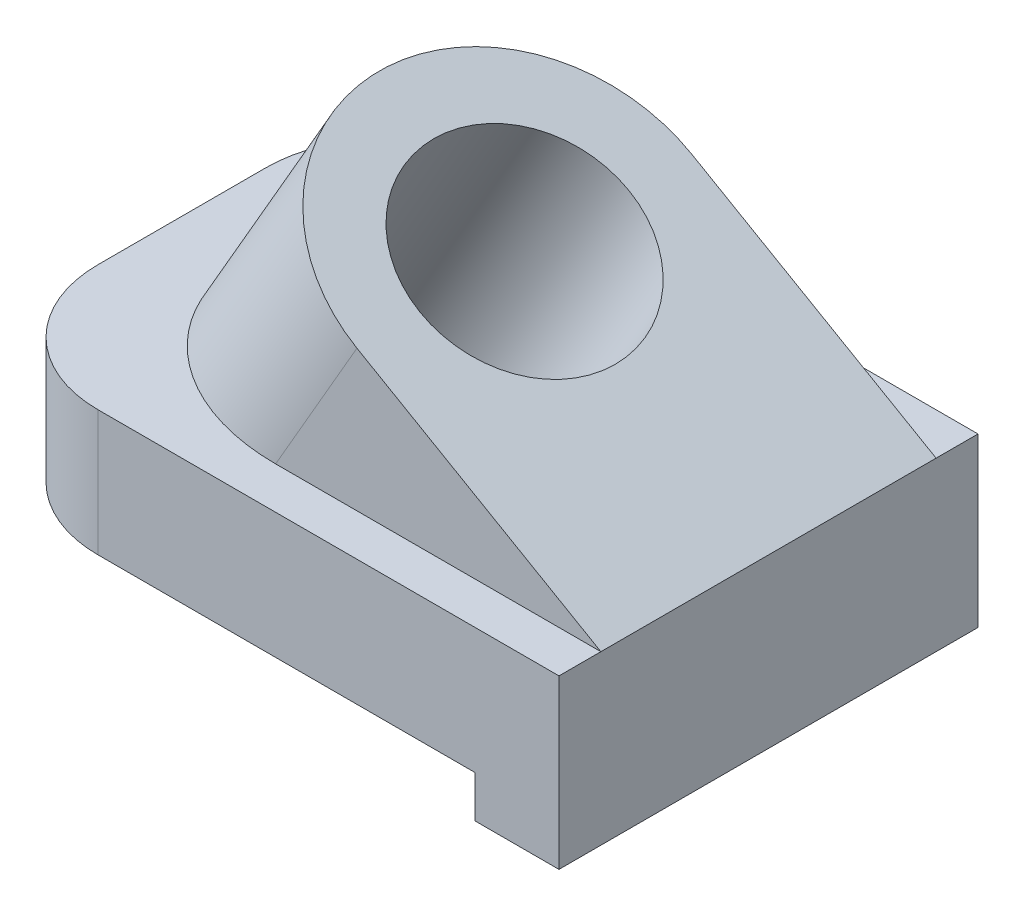
ISO-10303-21;
HEADER;
FILE_DESCRIPTION(('STEP AP214'),'2;1');
FILE_NAME('part.step','',(''),(''),'','','');
FILE_SCHEMA(('AUTOMOTIVE_DESIGN { 1 0 10303 214 1 1 1 1 }'));
ENDSEC;
DATA;
#1=APPLICATION_CONTEXT('core data for automotive mechanical design processes');
#2=APPLICATION_PROTOCOL_DEFINITION('international standard','automotive_design',2000,#1);
#3=PRODUCT_CONTEXT('',#1,'mechanical');
#4=PRODUCT('Part','Part','',(#3));
#5=PRODUCT_RELATED_PRODUCT_CATEGORY('part','',(#4));
#6=PRODUCT_DEFINITION_FORMATION('','',#4);
#7=PRODUCT_DEFINITION_CONTEXT('part definition',#1,'design');
#8=PRODUCT_DEFINITION('design','',#6,#7);
#9=PRODUCT_DEFINITION_SHAPE('','',#8);
#10=(LENGTH_UNIT() NAMED_UNIT(*) SI_UNIT(.MILLI.,.METRE.));
#11=(NAMED_UNIT(*) PLANE_ANGLE_UNIT() SI_UNIT($,.RADIAN.));
#12=(NAMED_UNIT(*) SI_UNIT($,.STERADIAN.) SOLID_ANGLE_UNIT());
#13=UNCERTAINTY_MEASURE_WITH_UNIT(LENGTH_MEASURE(1.E-05),#10,'distance_accuracy_value','');
#14=(GEOMETRIC_REPRESENTATION_CONTEXT(3) GLOBAL_UNCERTAINTY_ASSIGNED_CONTEXT((#13)) GLOBAL_UNIT_ASSIGNED_CONTEXT((#10,
#11,#12)) REPRESENTATION_CONTEXT('',''));
#15=CARTESIAN_POINT('',(0.,0.,0.));
#16=DIRECTION('',(0.,0.,1.));
#17=DIRECTION('',(1.,0.,0.));
#18=AXIS2_PLACEMENT_3D('',#15,#16,#17);
#19=CARTESIAN_POINT('',(70.,20.,25.));
#20=DIRECTION('',(0.,-1.,0.));
#21=DIRECTION('',(1.,0.,0.));
#22=AXIS2_PLACEMENT_3D('',#19,#20,#21);
#23=PLANE('',#22);
#24=DIRECTION('',(1.,0.,0.));
#25=VECTOR('',#24,1.);
#26=CARTESIAN_POINT('',(-2.87710911225075,20.,20.));
#27=LINE('',#26,#25);
#28=CARTESIAN_POINT('',(31.1896782116154,20.,20.));
#29=VERTEX_POINT('',#28);
#30=CARTESIAN_POINT('',(70.,20.,20.));
#31=VERTEX_POINT('',#30);
#32=EDGE_CURVE('E48',#29,#31,#27,.T.);
#33=ORIENTED_EDGE('',*,*,#32,.F.);
#34=CARTESIAN_POINT('',(31.1896782116154,20.,0.));
#35=DIRECTION('',(0.,-1.,0.));
#36=DIRECTION('',(1.,0.,0.));
#37=AXIS2_PLACEMENT_3D('',#34,#35,#36);
#38=ELLIPSE('',#37,23.0940107675851,20.);
#39=CARTESIAN_POINT('',(31.1896782116154,20.,-20.));
#40=VERTEX_POINT('',#39);
#41=EDGE_CURVE('E122',#40,#29,#38,.F.);
#42=ORIENTED_EDGE('',*,*,#41,.F.);
#43=DIRECTION('',(-1.,0.,0.));
#44=VECTOR('',#43,1.);
#45=CARTESIAN_POINT('',(26.2306322290376,20.,-20.));
#46=LINE('',#45,#44);
#47=CARTESIAN_POINT('',(70.,20.,-20.));
#48=VERTEX_POINT('',#47);
#49=EDGE_CURVE('E54',#48,#40,#46,.T.);
#50=ORIENTED_EDGE('',*,*,#49,.F.);
#51=DIRECTION('',(0.,0.,-1.));
#52=VECTOR('',#51,1.);
#53=CARTESIAN_POINT('',(70.,20.,25.));
#54=LINE('',#53,#52);
#55=CARTESIAN_POINT('',(70.,20.,-25.));
#56=VERTEX_POINT('',#55);
#57=EDGE_CURVE('E182',#48,#56,#54,.T.);
#58=ORIENTED_EDGE('',*,*,#57,.T.);
#59=DIRECTION('',(-1.,0.,0.));
#60=VECTOR('',#59,1.);
#61=CARTESIAN_POINT('',(70.,20.,-25.));
#62=LINE('',#61,#60);
#63=CARTESIAN_POINT('',(15.,20.,-25.));
#64=VERTEX_POINT('',#63);
#65=EDGE_CURVE('E170',#56,#64,#62,.T.);
#66=ORIENTED_EDGE('',*,*,#65,.T.);
#67=CARTESIAN_POINT('',(15.,20.,-10.));
#68=DIRECTION('',(0.,-1.,0.));
#69=DIRECTION('',(1.,0.,0.));
#70=AXIS2_PLACEMENT_3D('',#67,#68,#69);
#71=CIRCLE('',#70,15.);
#72=CARTESIAN_POINT('',(0.,20.,-10.));
#73=VERTEX_POINT('',#72);
#74=EDGE_CURVE('E41',#64,#73,#71,.F.);
#75=ORIENTED_EDGE('',*,*,#74,.T.);
#76=DIRECTION('',(0.,0.,-1.));
#77=VECTOR('',#76,1.);
#78=CARTESIAN_POINT('',(0.,20.,25.));
#79=LINE('',#78,#77);
#80=CARTESIAN_POINT('',(0.,20.,10.));
#81=VERTEX_POINT('',#80);
#82=EDGE_CURVE('E179',#81,#73,#79,.T.);
#83=ORIENTED_EDGE('',*,*,#82,.F.);
#84=CARTESIAN_POINT('',(15.,20.,10.));
#85=DIRECTION('',(0.,-1.,0.));
#86=DIRECTION('',(1.,0.,0.));
#87=AXIS2_PLACEMENT_3D('',#84,#85,#86);
#88=CIRCLE('',#87,15.);
#89=CARTESIAN_POINT('',(15.,20.,25.));
#90=VERTEX_POINT('',#89);
#91=EDGE_CURVE('E202',#81,#90,#88,.F.);
#92=ORIENTED_EDGE('',*,*,#91,.T.);
#93=DIRECTION('',(-1.,0.,0.));
#94=VECTOR('',#93,1.);
#95=CARTESIAN_POINT('',(70.,20.,25.));
#96=LINE('',#95,#94);
#97=CARTESIAN_POINT('',(70.,20.,25.));
#98=VERTEX_POINT('',#97);
#99=EDGE_CURVE('E157',#98,#90,#96,.T.);
#100=ORIENTED_EDGE('',*,*,#99,.F.);
#101=EDGE_CURVE('E183',#98,#31,#54,.T.);
#102=ORIENTED_EDGE('',*,*,#101,.T.);
#103=EDGE_LOOP('',(#33,#42,#50,#58,#66,#75,#83,#92,#100,#102));
#104=FACE_BOUND('',#103,.T.);
#105=ADVANCED_FACE('F33',(#104),#23,.F.);
#106=CARTESIAN_POINT('',(60.,5.00000000000002,25.));
#107=DIRECTION('',(1.,0.,0.));
#108=DIRECTION('',(0.,0.,-1.));
#109=AXIS2_PLACEMENT_3D('',#106,#107,#108);
#110=PLANE('',#109);
#111=DIRECTION('',(0.,-1.,0.));
#112=VECTOR('',#111,1.);
#113=CARTESIAN_POINT('',(60.,5.00000000000002,-25.));
#114=LINE('',#113,#112);
#115=CARTESIAN_POINT('',(60.,5.00000000000002,-25.));
#116=VERTEX_POINT('',#115);
#117=CARTESIAN_POINT('',(60.,0.,-25.));
#118=VERTEX_POINT('',#117);
#119=EDGE_CURVE('E146',#116,#118,#114,.T.);
#120=ORIENTED_EDGE('',*,*,#119,.T.);
#121=DIRECTION('',(0.,0.,-1.));
#122=VECTOR('',#121,1.);
#123=CARTESIAN_POINT('',(60.,0.,25.));
#124=LINE('',#123,#122);
#125=CARTESIAN_POINT('',(60.,0.,25.));
#126=VERTEX_POINT('',#125);
#127=EDGE_CURVE('E188',#126,#118,#124,.T.);
#128=ORIENTED_EDGE('',*,*,#127,.F.);
#129=DIRECTION('',(0.,-1.,0.));
#130=VECTOR('',#129,1.);
#131=CARTESIAN_POINT('',(60.,5.00000000000002,25.));
#132=LINE('',#131,#130);
#133=CARTESIAN_POINT('',(60.,5.00000000000002,25.));
#134=VERTEX_POINT('',#133);
#135=EDGE_CURVE('E149',#134,#126,#132,.T.);
#136=ORIENTED_EDGE('',*,*,#135,.F.);
#137=DIRECTION('',(0.,0.,-1.));
#138=VECTOR('',#137,1.);
#139=CARTESIAN_POINT('',(60.,5.00000000000002,25.));
#140=LINE('',#139,#138);
#141=EDGE_CURVE('E162',#134,#116,#140,.T.);
#142=ORIENTED_EDGE('',*,*,#141,.T.);
#143=EDGE_LOOP('',(#120,#128,#136,#142));
#144=FACE_BOUND('',#143,.T.);
#145=ADVANCED_FACE('F225',(#144),#110,.F.);
#146=CARTESIAN_POINT('',(60.,0.,25.));
#147=DIRECTION('',(0.,1.,0.));
#148=DIRECTION('',(-1.,0.,0.));
#149=AXIS2_PLACEMENT_3D('',#146,#147,#148);
#150=PLANE('',#149);
#151=DIRECTION('',(1.,0.,0.));
#152=VECTOR('',#151,1.);
#153=CARTESIAN_POINT('',(60.,0.,-25.));
#154=LINE('',#153,#152);
#155=CARTESIAN_POINT('',(70.,0.,-25.));
#156=VERTEX_POINT('',#155);
#157=EDGE_CURVE('E165',#118,#156,#154,.T.);
#158=ORIENTED_EDGE('',*,*,#157,.T.);
#159=DIRECTION('',(0.,0.,-1.));
#160=VECTOR('',#159,1.);
#161=CARTESIAN_POINT('',(70.,0.,25.));
#162=LINE('',#161,#160);
#163=CARTESIAN_POINT('',(70.,0.,25.));
#164=VERTEX_POINT('',#163);
#165=EDGE_CURVE('E185',#164,#156,#162,.T.);
#166=ORIENTED_EDGE('',*,*,#165,.F.);
#167=DIRECTION('',(1.,0.,0.));
#168=VECTOR('',#167,1.);
#169=CARTESIAN_POINT('',(60.,0.,25.));
#170=LINE('',#169,#168);
#171=EDGE_CURVE('E152',#126,#164,#170,.T.);
#172=ORIENTED_EDGE('',*,*,#171,.F.);
#173=ORIENTED_EDGE('',*,*,#127,.T.);
#174=EDGE_LOOP('',(#158,#166,#172,#173));
#175=FACE_BOUND('',#174,.T.);
#176=ADVANCED_FACE('F254',(#175),#150,.F.);
#177=CARTESIAN_POINT('',(70.,0.,25.));
#178=DIRECTION('',(-1.,0.,0.));
#179=DIRECTION('',(0.,0.,1.));
#180=AXIS2_PLACEMENT_3D('',#177,#178,#179);
#181=PLANE('',#180);
#182=DIRECTION('',(0.,1.,0.));
#183=VECTOR('',#182,1.);
#184=CARTESIAN_POINT('',(70.,0.,-25.));
#185=LINE('',#184,#183);
#186=EDGE_CURVE('E167',#156,#56,#185,.T.);
#187=ORIENTED_EDGE('',*,*,#186,.T.);
#188=ORIENTED_EDGE('',*,*,#57,.F.);
#189=DIRECTION('',(0.,0.,-1.));
#190=VECTOR('',#189,1.);
#191=CARTESIAN_POINT('',(70.,20.,20.));
#192=LINE('',#191,#190);
#193=EDGE_CURVE('E130',#31,#48,#192,.T.);
#194=ORIENTED_EDGE('',*,*,#193,.F.);
#195=ORIENTED_EDGE('',*,*,#101,.F.);
#196=DIRECTION('',(0.,1.,0.));
#197=VECTOR('',#196,1.);
#198=CARTESIAN_POINT('',(70.,0.,25.));
#199=LINE('',#198,#197);
#200=EDGE_CURVE('E155',#164,#98,#199,.T.);
#201=ORIENTED_EDGE('',*,*,#200,.F.);
#202=ORIENTED_EDGE('',*,*,#165,.T.);
#203=EDGE_LOOP('',(#187,#188,#194,#195,#201,#202));
#204=FACE_BOUND('',#203,.T.);
#205=ADVANCED_FACE('F236',(#204),#181,.F.);
#206=CARTESIAN_POINT('',(0.,20.,25.));
#207=DIRECTION('',(1.,0.,0.));
#208=DIRECTION('',(0.,1.,0.));
#209=AXIS2_PLACEMENT_3D('',#206,#207,#208);
#210=PLANE('',#209);
#211=ORIENTED_EDGE('',*,*,#82,.T.);
#212=DIRECTION('',(0.,-1.,0.));
#213=VECTOR('',#212,1.);
#214=CARTESIAN_POINT('',(0.,20.,-10.));
#215=LINE('',#214,#213);
#216=CARTESIAN_POINT('',(0.,5.00000000000002,-10.));
#217=VERTEX_POINT('',#216);
#218=EDGE_CURVE('E193',#73,#217,#215,.T.);
#219=ORIENTED_EDGE('',*,*,#218,.T.);
#220=DIRECTION('',(0.,0.,-1.));
#221=VECTOR('',#220,1.);
#222=CARTESIAN_POINT('',(0.,5.00000000000002,25.));
#223=LINE('',#222,#221);
#224=CARTESIAN_POINT('',(0.,5.00000000000002,10.));
#225=VERTEX_POINT('',#224);
#226=EDGE_CURVE('E176',#225,#217,#223,.T.);
#227=ORIENTED_EDGE('',*,*,#226,.F.);
#228=DIRECTION('',(0.,-1.,0.));
#229=VECTOR('',#228,1.);
#230=CARTESIAN_POINT('',(0.,20.,10.));
#231=LINE('',#230,#229);
#232=EDGE_CURVE('E191',#225,#81,#231,.F.);
#233=ORIENTED_EDGE('',*,*,#232,.T.);
#234=EDGE_LOOP('',(#211,#219,#227,#233));
#235=FACE_BOUND('',#234,.T.);
#236=ADVANCED_FACE('F211',(#235),#210,.F.);
#237=CARTESIAN_POINT('',(0.,5.00000000000002,25.));
#238=DIRECTION('',(0.,1.,0.));
#239=DIRECTION('',(-1.,0.,0.));
#240=AXIS2_PLACEMENT_3D('',#237,#238,#239);
#241=PLANE('',#240);
#242=CARTESIAN_POINT('',(22.529424173771,5.00000000000002,0.));
#243=DIRECTION('',(0.,1.,0.));
#244=DIRECTION('',(1.,0.,0.));
#245=AXIS2_PLACEMENT_3D('',#242,#243,#244);
#246=ELLIPSE('',#245,14.4337567297407,12.5);
#247=CARTESIAN_POINT('',(36.9631809035117,5.00000000000002,0.));
#248=VERTEX_POINT('',#247);
#249=EDGE_CURVE('E131',#248,#248,#246,.T.);
#250=ORIENTED_EDGE('',*,*,#249,.T.);
#251=EDGE_LOOP('',(#250));
#252=FACE_BOUND('',#251,.T.);
#253=ORIENTED_EDGE('',*,*,#226,.T.);
#254=CARTESIAN_POINT('',(15.,5.00000000000002,-10.));
#255=DIRECTION('',(0.,1.,0.));
#256=DIRECTION('',(-1.,0.,0.));
#257=AXIS2_PLACEMENT_3D('',#254,#255,#256);
#258=CIRCLE('',#257,15.);
#259=CARTESIAN_POINT('',(15.,5.00000000000002,-25.));
#260=VERTEX_POINT('',#259);
#261=EDGE_CURVE('E198',#217,#260,#258,.F.);
#262=ORIENTED_EDGE('',*,*,#261,.T.);
#263=DIRECTION('',(1.,0.,0.));
#264=VECTOR('',#263,1.);
#265=CARTESIAN_POINT('',(0.,5.00000000000002,-25.));
#266=LINE('',#265,#264);
#267=EDGE_CURVE('E153',#260,#116,#266,.T.);
#268=ORIENTED_EDGE('',*,*,#267,.T.);
#269=ORIENTED_EDGE('',*,*,#141,.F.);
#270=DIRECTION('',(1.,0.,0.));
#271=VECTOR('',#270,1.);
#272=CARTESIAN_POINT('',(0.,5.00000000000002,25.));
#273=LINE('',#272,#271);
#274=CARTESIAN_POINT('',(15.,5.00000000000002,25.));
#275=VERTEX_POINT('',#274);
#276=EDGE_CURVE('E160',#275,#134,#273,.T.);
#277=ORIENTED_EDGE('',*,*,#276,.F.);
#278=CARTESIAN_POINT('',(15.,5.00000000000002,10.));
#279=DIRECTION('',(0.,1.,0.));
#280=DIRECTION('',(-1.,0.,0.));
#281=AXIS2_PLACEMENT_3D('',#278,#279,#280);
#282=CIRCLE('',#281,15.);
#283=EDGE_CURVE('E196',#275,#225,#282,.F.);
#284=ORIENTED_EDGE('',*,*,#283,.T.);
#285=EDGE_LOOP('',(#253,#262,#268,#269,#277,#284));
#286=FACE_BOUND('',#285,.T.);
#287=ADVANCED_FACE('F217',(#252,#286),#241,.F.);
#288=CARTESIAN_POINT('',(0.,0.,25.));
#289=DIRECTION('',(0.,0.,1.));
#290=DIRECTION('',(1.,0.,0.));
#291=AXIS2_PLACEMENT_3D('',#288,#289,#290);
#292=PLANE('',#291);
#293=ORIENTED_EDGE('',*,*,#99,.T.);
#294=DIRECTION('',(0.,-1.,0.));
#295=VECTOR('',#294,1.);
#296=CARTESIAN_POINT('',(15.,5.00000000000001,25.));
#297=LINE('',#296,#295);
#298=EDGE_CURVE('E11',#90,#275,#297,.T.);
#299=ORIENTED_EDGE('',*,*,#298,.T.);
#300=ORIENTED_EDGE('',*,*,#276,.T.);
#301=ORIENTED_EDGE('',*,*,#135,.T.);
#302=ORIENTED_EDGE('',*,*,#171,.T.);
#303=ORIENTED_EDGE('',*,*,#200,.T.);
#304=EDGE_LOOP('',(#293,#299,#300,#301,#302,#303));
#305=FACE_BOUND('',#304,.T.);
#306=ADVANCED_FACE('F229',(#305),#292,.T.);
#307=CARTESIAN_POINT('',(0.,0.,-25.));
#308=DIRECTION('',(0.,0.,1.));
#309=DIRECTION('',(1.,0.,0.));
#310=AXIS2_PLACEMENT_3D('',#307,#308,#309);
#311=PLANE('',#310);
#312=ORIENTED_EDGE('',*,*,#267,.F.);
#313=DIRECTION('',(0.,-1.,0.));
#314=VECTOR('',#313,1.);
#315=CARTESIAN_POINT('',(15.,0.,-25.));
#316=LINE('',#315,#314);
#317=EDGE_CURVE('E200',#260,#64,#316,.F.);
#318=ORIENTED_EDGE('',*,*,#317,.T.);
#319=ORIENTED_EDGE('',*,*,#65,.F.);
#320=ORIENTED_EDGE('',*,*,#186,.F.);
#321=ORIENTED_EDGE('',*,*,#157,.F.);
#322=ORIENTED_EDGE('',*,*,#119,.F.);
#323=EDGE_LOOP('',(#312,#318,#319,#320,#321,#322));
#324=FACE_BOUND('',#323,.T.);
#325=ADVANCED_FACE('F221',(#324),#311,.F.);
#326=CARTESIAN_POINT('',(15.,20.,-10.));
#327=DIRECTION('',(0.,-1.,0.));
#328=DIRECTION('',(1.,0.,0.));
#329=AXIS2_PLACEMENT_3D('',#326,#327,#328);
#330=CYLINDRICAL_SURFACE('',#329,15.);
#331=ORIENTED_EDGE('',*,*,#74,.F.);
#332=ORIENTED_EDGE('',*,*,#317,.F.);
#333=ORIENTED_EDGE('',*,*,#261,.F.);
#334=ORIENTED_EDGE('',*,*,#218,.F.);
#335=EDGE_LOOP('',(#331,#332,#333,#334));
#336=FACE_BOUND('',#335,.T.);
#337=ADVANCED_FACE('F214',(#336),#330,.T.);
#338=CARTESIAN_POINT('',(15.,0.,10.));
#339=DIRECTION('',(0.,1.,0.));
#340=DIRECTION('',(-1.,0.,0.));
#341=AXIS2_PLACEMENT_3D('',#338,#339,#340);
#342=CYLINDRICAL_SURFACE('',#341,15.);
#343=ORIENTED_EDGE('',*,*,#91,.F.);
#344=ORIENTED_EDGE('',*,*,#232,.F.);
#345=ORIENTED_EDGE('',*,*,#283,.F.);
#346=ORIENTED_EDGE('',*,*,#298,.F.);
#347=EDGE_LOOP('',(#343,#344,#345,#346));
#348=FACE_BOUND('',#347,.T.);
#349=ADVANCED_FACE('F35',(#348),#342,.T.);
#350=CARTESIAN_POINT('',(40.8922586587116,36.8053622988949,0.));
#351=DIRECTION('',(0.500000000000001,0.866025403784438,0.));
#352=DIRECTION('',(-0.866025403784438,0.500000000000001,0.));
#353=AXIS2_PLACEMENT_3D('',#350,#351,#352);
#354=PLANE('',#353);
#355=CARTESIAN_POINT('',(40.8922586587116,36.8053622988949,0.));
#356=DIRECTION('',(0.500000000000001,0.866025403784438,0.));
#357=DIRECTION('',(-0.866025403784438,0.500000000000001,0.));
#358=AXIS2_PLACEMENT_3D('',#355,#356,#357);
#359=CIRCLE('',#358,12.5);
#360=CARTESIAN_POINT('',(30.0669411114061,43.0553622988949,0.));
#361=VERTEX_POINT('',#360);
#362=EDGE_CURVE('E280',#361,#361,#359,.T.);
#363=ORIENTED_EDGE('',*,*,#362,.F.);
#364=EDGE_LOOP('',(#363));
#365=FACE_BOUND('',#364,.T.);
#366=DIRECTION('',(0.866025403784438,-0.500000000000001,0.));
#367=VECTOR('',#366,1.);
#368=CARTESIAN_POINT('',(40.8922586587116,36.8053622988949,20.));
#369=LINE('',#368,#367);
#370=CARTESIAN_POINT('',(40.8922586587116,36.8053622988949,20.));
#371=VERTEX_POINT('',#370);
#372=EDGE_CURVE('E126',#371,#31,#369,.T.);
#373=ORIENTED_EDGE('',*,*,#372,.T.);
#374=ORIENTED_EDGE('',*,*,#193,.T.);
#375=DIRECTION('',(-0.866025403784438,0.500000000000001,0.));
#376=VECTOR('',#375,1.);
#377=CARTESIAN_POINT('',(70.,20.,-20.));
#378=LINE('',#377,#376);
#379=CARTESIAN_POINT('',(40.8922586587116,36.8053622988949,-20.));
#380=VERTEX_POINT('',#379);
#381=EDGE_CURVE('E136',#48,#380,#378,.T.);
#382=ORIENTED_EDGE('',*,*,#381,.T.);
#383=CARTESIAN_POINT('',(40.8922586587116,36.8053622988949,0.));
#384=DIRECTION('',(0.500000000000001,0.866025403784438,0.));
#385=DIRECTION('',(-0.866025403784438,0.500000000000001,0.));
#386=AXIS2_PLACEMENT_3D('',#383,#384,#385);
#387=CIRCLE('',#386,20.);
#388=EDGE_CURVE('E121',#380,#371,#387,.T.);
#389=ORIENTED_EDGE('',*,*,#388,.T.);
#390=EDGE_LOOP('',(#373,#374,#382,#389));
#391=FACE_BOUND('',#390,.T.);
#392=ADVANCED_FACE('F134',(#365,#391),#354,.T.);
#393=CARTESIAN_POINT('',(26.2306322290377,-55.8107687944743,-20.));
#394=DIRECTION('',(0.,0.,-1.));
#395=DIRECTION('',(-1.,0.,0.));
#396=AXIS2_PLACEMENT_3D('',#393,#394,#395);
#397=PLANE('',#396);
#398=ORIENTED_EDGE('',*,*,#381,.F.);
#399=ORIENTED_EDGE('',*,*,#49,.T.);
#400=DIRECTION('',(0.500000000000001,0.866025403784438,0.));
#401=VECTOR('',#400,1.);
#402=CARTESIAN_POINT('',(-2.87710911225074,-39.0054064955794,-20.));
#403=LINE('',#402,#401);
#404=EDGE_CURVE('E138',#40,#380,#403,.T.);
#405=ORIENTED_EDGE('',*,*,#404,.T.);
#406=EDGE_LOOP('',(#398,#399,#405));
#407=FACE_BOUND('',#406,.T.);
#408=ADVANCED_FACE('F238',(#407),#397,.T.);
#409=CARTESIAN_POINT('',(-2.87710911225075,-39.0054064955794,0.));
#410=DIRECTION('',(0.500000000000001,0.866025403784438,0.));
#411=DIRECTION('',(-0.866025403784438,0.500000000000001,0.));
#412=AXIS2_PLACEMENT_3D('',#409,#410,#411);
#413=CYLINDRICAL_SURFACE('',#412,20.);
#414=ORIENTED_EDGE('',*,*,#404,.F.);
#415=ORIENTED_EDGE('',*,*,#41,.T.);
#416=DIRECTION('',(0.500000000000001,0.866025403784438,0.));
#417=VECTOR('',#416,1.);
#418=CARTESIAN_POINT('',(-2.87710911225075,-39.0054064955794,20.));
#419=LINE('',#418,#417);
#420=EDGE_CURVE('E116',#29,#371,#419,.T.);
#421=ORIENTED_EDGE('',*,*,#420,.T.);
#422=ORIENTED_EDGE('',*,*,#388,.F.);
#423=EDGE_LOOP('',(#414,#415,#421,#422));
#424=FACE_BOUND('',#423,.T.);
#425=ADVANCED_FACE('F119',(#424),#413,.T.);
#426=CARTESIAN_POINT('',(-2.87710911225074,-39.0054064955794,20.));
#427=DIRECTION('',(0.,0.,1.));
#428=DIRECTION('',(1.,0.,0.));
#429=AXIS2_PLACEMENT_3D('',#426,#427,#428);
#430=PLANE('',#429);
#431=ORIENTED_EDGE('',*,*,#420,.F.);
#432=ORIENTED_EDGE('',*,*,#32,.T.);
#433=ORIENTED_EDGE('',*,*,#372,.F.);
#434=EDGE_LOOP('',(#431,#432,#433));
#435=FACE_BOUND('',#434,.T.);
#436=ADVANCED_FACE('F127',(#435),#430,.T.);
#437=CARTESIAN_POINT('',(14.7320046208671,-8.50552683356044,0.));
#438=DIRECTION('',(0.500000000000001,0.866025403784438,0.));
#439=DIRECTION('',(-0.866025403784438,0.500000000000001,0.));
#440=AXIS2_PLACEMENT_3D('',#437,#438,#439);
#441=CYLINDRICAL_SURFACE('',#440,12.5);
#442=ORIENTED_EDGE('',*,*,#362,.T.);
#443=EDGE_LOOP('',(#442));
#444=FACE_BOUND('',#443,.T.);
#445=ORIENTED_EDGE('',*,*,#249,.F.);
#446=EDGE_LOOP('',(#445));
#447=FACE_BOUND('',#446,.T.);
#448=ADVANCED_FACE('F284',(#444,#447),#441,.F.);
#449=CLOSED_SHELL('',(#105,#145,#176,#205,#236,#287,#306,#325,#337,#349,#392,#408,#425,#436,#448));
#450=MANIFOLD_SOLID_BREP('B2',#449);
#451=ADVANCED_BREP_SHAPE_REPRESENTATION('',(#18,#450),#14);
#452=SHAPE_DEFINITION_REPRESENTATION(#9,#451);
ENDSEC;
END-ISO-10303-21;
